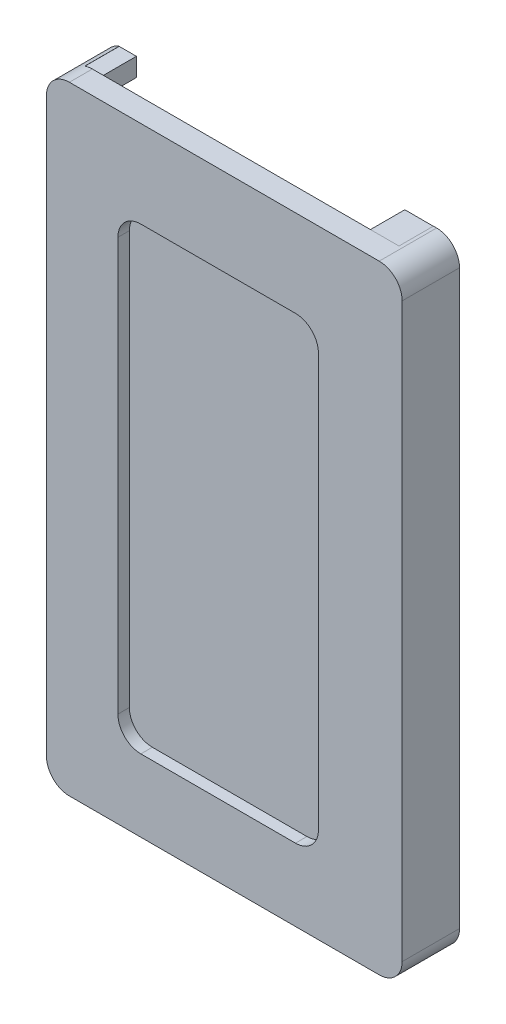
ISO-10303-21;
HEADER;
FILE_DESCRIPTION(('STEP AP214'),'2;1');
FILE_NAME('part.step','',(''),(''),'','','');
FILE_SCHEMA(('AUTOMOTIVE_DESIGN { 1 0 10303 214 1 1 1 1 }'));
ENDSEC;
DATA;
#1=APPLICATION_CONTEXT('core data for automotive mechanical design processes');
#2=APPLICATION_PROTOCOL_DEFINITION('international standard','automotive_design',2000,#1);
#3=PRODUCT_CONTEXT('',#1,'mechanical');
#4=PRODUCT('Part','Part','',(#3));
#5=PRODUCT_RELATED_PRODUCT_CATEGORY('part','',(#4));
#6=PRODUCT_DEFINITION_FORMATION('','',#4);
#7=PRODUCT_DEFINITION_CONTEXT('part definition',#1,'design');
#8=PRODUCT_DEFINITION('design','',#6,#7);
#9=PRODUCT_DEFINITION_SHAPE('','',#8);
#10=(LENGTH_UNIT() NAMED_UNIT(*) SI_UNIT(.MILLI.,.METRE.));
#11=(NAMED_UNIT(*) PLANE_ANGLE_UNIT() SI_UNIT($,.RADIAN.));
#12=(NAMED_UNIT(*) SI_UNIT($,.STERADIAN.) SOLID_ANGLE_UNIT());
#13=UNCERTAINTY_MEASURE_WITH_UNIT(LENGTH_MEASURE(1.E-05),#10,'distance_accuracy_value','');
#14=(GEOMETRIC_REPRESENTATION_CONTEXT(3) GLOBAL_UNCERTAINTY_ASSIGNED_CONTEXT((#13)) GLOBAL_UNIT_ASSIGNED_CONTEXT((#10,
#11,#12)) REPRESENTATION_CONTEXT('',''));
#15=CARTESIAN_POINT('',(0.,0.,0.));
#16=DIRECTION('',(0.,0.,1.));
#17=DIRECTION('',(1.,0.,0.));
#18=AXIS2_PLACEMENT_3D('',#15,#16,#17);
#19=CARTESIAN_POINT('',(38.4138867747377,-26.7518966455588,18.));
#20=DIRECTION('',(1.,0.,0.));
#21=DIRECTION('',(0.,0.,-1.));
#22=AXIS2_PLACEMENT_3D('',#19,#20,#21);
#23=PLANE('',#22);
#24=DIRECTION('',(0.,-1.,0.));
#25=VECTOR('',#24,1.);
#26=CARTESIAN_POINT('',(38.4138867747377,-26.7518966455588,18.));
#27=LINE('',#26,#25);
#28=CARTESIAN_POINT('',(38.4138867747377,-25.0005109041785,18.));
#29=VERTEX_POINT('',#28);
#30=CARTESIAN_POINT('',(38.4138867747377,-25.0095991490639,18.));
#31=VERTEX_POINT('',#30);
#32=EDGE_CURVE('E406',#29,#31,#27,.T.);
#33=ORIENTED_EDGE('',*,*,#32,.T.);
#34=DIRECTION('',(0.,0.,1.));
#35=VECTOR('',#34,1.);
#36=CARTESIAN_POINT('',(38.4138867747377,-25.0095991490639,15.));
#37=LINE('',#36,#35);
#38=CARTESIAN_POINT('',(38.4138867747377,-25.0095991490639,15.));
#39=VERTEX_POINT('',#38);
#40=EDGE_CURVE('E81',#39,#31,#37,.T.);
#41=ORIENTED_EDGE('',*,*,#40,.F.);
#42=DIRECTION('',(0.,-1.,0.));
#43=VECTOR('',#42,1.);
#44=CARTESIAN_POINT('',(38.4138867747377,-26.7518966455588,15.));
#45=LINE('',#44,#43);
#46=CARTESIAN_POINT('',(38.4138867747377,-25.0005109041785,15.));
#47=VERTEX_POINT('',#46);
#48=EDGE_CURVE('E274',#47,#39,#45,.T.);
#49=ORIENTED_EDGE('',*,*,#48,.F.);
#50=DIRECTION('',(0.,0.,1.));
#51=VECTOR('',#50,1.);
#52=CARTESIAN_POINT('',(38.4138867747377,-25.0005109041785,18.));
#53=LINE('',#52,#51);
#54=EDGE_CURVE('E66',#47,#29,#53,.T.);
#55=ORIENTED_EDGE('',*,*,#54,.T.);
#56=EDGE_LOOP('',(#33,#41,#49,#55));
#57=FACE_BOUND('',#56,.T.);
#58=ADVANCED_FACE('F58',(#57),#23,.T.);
#59=CARTESIAN_POINT('',(65.7954731172422,-26.7518966455588,18.));
#60=DIRECTION('',(1.,0.,0.));
#61=DIRECTION('',(0.,1.,0.));
#62=AXIS2_PLACEMENT_3D('',#59,#60,#61);
#63=PLANE('',#62);
#64=DIRECTION('',(0.,0.,1.));
#65=VECTOR('',#64,1.);
#66=CARTESIAN_POINT('',(65.7954731172422,-26.6161419497379,15.));
#67=LINE('',#66,#65);
#68=CARTESIAN_POINT('',(65.7954731172422,-26.6161419497379,15.));
#69=VERTEX_POINT('',#68);
#70=CARTESIAN_POINT('',(65.7954731172422,-26.6161419497379,18.));
#71=VERTEX_POINT('',#70);
#72=EDGE_CURVE('E320',#69,#71,#67,.T.);
#73=ORIENTED_EDGE('',*,*,#72,.F.);
#74=DIRECTION('',(0.,-1.,0.));
#75=VECTOR('',#74,1.);
#76=CARTESIAN_POINT('',(65.7954731172422,-26.7518966455588,15.));
#77=LINE('',#76,#75);
#78=CARTESIAN_POINT('',(65.7954731172423,-77.1753131264585,15.));
#79=VERTEX_POINT('',#78);
#80=EDGE_CURVE('E412',#69,#79,#77,.T.);
#81=ORIENTED_EDGE('',*,*,#80,.T.);
#82=DIRECTION('',(0.,0.,-1.));
#83=VECTOR('',#82,1.);
#84=CARTESIAN_POINT('',(65.7954731172423,-77.1753131264585,18.));
#85=LINE('',#84,#83);
#86=CARTESIAN_POINT('',(65.7954731172423,-77.1753131264585,18.));
#87=VERTEX_POINT('',#86);
#88=EDGE_CURVE('E417',#87,#79,#85,.T.);
#89=ORIENTED_EDGE('',*,*,#88,.F.);
#90=DIRECTION('',(0.,-1.,0.));
#91=VECTOR('',#90,1.);
#92=CARTESIAN_POINT('',(65.7954731172422,-26.7518966455588,18.));
#93=LINE('',#92,#91);
#94=EDGE_CURVE('E401',#71,#87,#93,.T.);
#95=ORIENTED_EDGE('',*,*,#94,.F.);
#96=EDGE_LOOP('',(#73,#81,#89,#95));
#97=FACE_BOUND('',#96,.T.);
#98=ADVANCED_FACE('F535',(#97),#63,.F.);
#99=CARTESIAN_POINT('',(0.,0.,15.));
#100=DIRECTION('',(0.,0.,-1.));
#101=DIRECTION('',(-1.,0.,0.));
#102=AXIS2_PLACEMENT_3D('',#99,#100,#101);
#103=PLANE('',#102);
#104=CARTESIAN_POINT('',(65.7954731172422,-24.8876513413796,15.));
#105=VERTEX_POINT('',#104);
#106=CARTESIAN_POINT('',(65.7954731172422,-24.894344301853,15.));
#107=VERTEX_POINT('',#106);
#108=EDGE_CURVE('E413',#105,#107,#77,.T.);
#109=ORIENTED_EDGE('',*,*,#108,.F.);
#110=DIRECTION('',(1.,0.,0.));
#111=VECTOR('',#110,1.);
#112=CARTESIAN_POINT('',(37.076231828528,-24.8876513413796,15.));
#113=LINE('',#112,#111);
#114=CARTESIAN_POINT('',(66.076231828528,-24.8876513413796,15.));
#115=VERTEX_POINT('',#114);
#116=EDGE_CURVE('E426',#105,#115,#113,.T.);
#117=ORIENTED_EDGE('',*,*,#116,.T.);
#118=CARTESIAN_POINT('',(66.076231828528,-26.8876513413796,15.));
#119=DIRECTION('',(0.,0.,-1.));
#120=DIRECTION('',(-1.,0.,0.));
#121=AXIS2_PLACEMENT_3D('',#118,#119,#120);
#122=CIRCLE('',#121,2.);
#123=CARTESIAN_POINT('',(68.076231828528,-26.8876513413796,15.));
#124=VERTEX_POINT('',#123);
#125=EDGE_CURVE('E436',#115,#124,#122,.T.);
#126=ORIENTED_EDGE('',*,*,#125,.T.);
#127=DIRECTION('',(0.,-1.,0.));
#128=VECTOR('',#127,1.);
#129=CARTESIAN_POINT('',(68.076231828528,-24.8876513413796,15.));
#130=LINE('',#129,#128);
#131=CARTESIAN_POINT('',(68.076231828528,-76.7564287427443,15.));
#132=VERTEX_POINT('',#131);
#133=EDGE_CURVE('E423',#124,#132,#130,.T.);
#134=ORIENTED_EDGE('',*,*,#133,.T.);
#135=CARTESIAN_POINT('',(66.076231828528,-76.7564287427443,15.));
#136=DIRECTION('',(0.,0.,-1.));
#137=DIRECTION('',(-1.,0.,0.));
#138=AXIS2_PLACEMENT_3D('',#135,#136,#137);
#139=CIRCLE('',#138,2.);
#140=CARTESIAN_POINT('',(66.076231828528,-78.7564287427443,15.));
#141=VERTEX_POINT('',#140);
#142=EDGE_CURVE('E442',#132,#141,#139,.T.);
#143=ORIENTED_EDGE('',*,*,#142,.T.);
#144=DIRECTION('',(1.,0.,0.));
#145=VECTOR('',#144,1.);
#146=CARTESIAN_POINT('',(37.076231828528,-78.7564287427443,15.));
#147=LINE('',#146,#145);
#148=CARTESIAN_POINT('',(55.1900802237575,-78.7564287427443,15.));
#149=VERTEX_POINT('',#148);
#150=EDGE_CURVE('E420',#149,#141,#147,.T.);
#151=ORIENTED_EDGE('',*,*,#150,.F.);
#152=DIRECTION('',(0.,-1.,0.));
#153=VECTOR('',#152,1.);
#154=CARTESIAN_POINT('',(55.1900802237575,-77.1753131264585,15.));
#155=LINE('',#154,#153);
#156=CARTESIAN_POINT('',(55.1900802237575,-77.1753131264585,15.));
#157=VERTEX_POINT('',#156);
#158=EDGE_CURVE('E375',#157,#149,#155,.T.);
#159=ORIENTED_EDGE('',*,*,#158,.F.);
#160=DIRECTION('',(1.,0.,0.));
#161=VECTOR('',#160,1.);
#162=CARTESIAN_POINT('',(38.4138867747377,-77.1753131264585,15.));
#163=LINE('',#162,#161);
#164=EDGE_CURVE('E390',#157,#79,#163,.T.);
#165=ORIENTED_EDGE('',*,*,#164,.T.);
#166=ORIENTED_EDGE('',*,*,#80,.F.);
#167=DIRECTION('',(-1.,0.,0.));
#168=VECTOR('',#167,1.);
#169=CARTESIAN_POINT('',(0.,-26.6161419497379,15.));
#170=LINE('',#169,#168);
#171=CARTESIAN_POINT('',(63.3048441622965,-26.6161419497379,15.));
#172=VERTEX_POINT('',#171);
#173=EDGE_CURVE('E310',#69,#172,#170,.T.);
#174=ORIENTED_EDGE('',*,*,#173,.T.);
#175=DIRECTION('',(0.,-1.,0.));
#176=VECTOR('',#175,1.);
#177=CARTESIAN_POINT('',(63.3048441622965,0.,15.));
#178=LINE('',#177,#176);
#179=CARTESIAN_POINT('',(63.3048441622965,-24.894344301853,15.));
#180=VERTEX_POINT('',#179);
#181=EDGE_CURVE('E303',#180,#172,#178,.T.);
#182=ORIENTED_EDGE('',*,*,#181,.F.);
#183=DIRECTION('',(-1.,0.,0.));
#184=VECTOR('',#183,1.);
#185=CARTESIAN_POINT('',(0.,-24.894344301853,15.));
#186=LINE('',#185,#184);
#187=EDGE_CURVE('E306',#107,#180,#186,.T.);
#188=ORIENTED_EDGE('',*,*,#187,.F.);
#189=EDGE_LOOP('',(#109,#117,#126,#134,#143,#151,#159,#165,#166,#174,#182,#188));
#190=FACE_BOUND('',#189,.T.);
#191=ADVANCED_FACE('F540',(#190),#103,.T.);
#192=CARTESIAN_POINT('',(39.076231828528,-26.8876513413796,15.));
#193=DIRECTION('',(0.,0.,-1.));
#194=DIRECTION('',(-1.,0.,0.));
#195=AXIS2_PLACEMENT_3D('',#192,#193,#194);
#196=CIRCLE('',#195,2.);
#197=CARTESIAN_POINT('',(37.076231828528,-26.8876513413796,15.));
#198=VERTEX_POINT('',#197);
#199=EDGE_CURVE('E438',#198,#47,#196,.T.);
#200=ORIENTED_EDGE('',*,*,#199,.T.);
#201=ORIENTED_EDGE('',*,*,#48,.T.);
#202=DIRECTION('',(1.,0.,0.));
#203=VECTOR('',#202,1.);
#204=CARTESIAN_POINT('',(0.,-25.0095991490639,15.));
#205=LINE('',#204,#203);
#206=CARTESIAN_POINT('',(39.9138867747377,-25.0095991490639,15.));
#207=VERTEX_POINT('',#206);
#208=EDGE_CURVE('E266',#39,#207,#205,.T.);
#209=ORIENTED_EDGE('',*,*,#208,.T.);
#210=DIRECTION('',(0.,-1.,0.));
#211=VECTOR('',#210,1.);
#212=CARTESIAN_POINT('',(39.9138867747377,0.,15.));
#213=LINE('',#212,#211);
#214=CARTESIAN_POINT('',(39.9138867747377,-26.6161419497379,15.));
#215=VERTEX_POINT('',#214);
#216=EDGE_CURVE('E272',#207,#215,#213,.T.);
#217=ORIENTED_EDGE('',*,*,#216,.T.);
#218=DIRECTION('',(1.,0.,0.));
#219=VECTOR('',#218,1.);
#220=CARTESIAN_POINT('',(0.,-26.616141949738,15.));
#221=LINE('',#220,#219);
#222=CARTESIAN_POINT('',(38.4138867747377,-26.6161419497379,15.));
#223=VERTEX_POINT('',#222);
#224=EDGE_CURVE('E276',#223,#215,#221,.T.);
#225=ORIENTED_EDGE('',*,*,#224,.F.);
#226=CARTESIAN_POINT('',(38.4138867747377,-77.1753131264585,15.));
#227=VERTEX_POINT('',#226);
#228=EDGE_CURVE('E73',#223,#227,#45,.T.);
#229=ORIENTED_EDGE('',*,*,#228,.T.);
#230=CARTESIAN_POINT('',(40.1900802237575,-77.1753131264585,15.));
#231=VERTEX_POINT('',#230);
#232=EDGE_CURVE('E409',#227,#231,#163,.T.);
#233=ORIENTED_EDGE('',*,*,#232,.T.);
#234=DIRECTION('',(0.,-1.,0.));
#235=VECTOR('',#234,1.);
#236=CARTESIAN_POINT('',(40.1900802237575,-77.1753131264585,15.));
#237=LINE('',#236,#235);
#238=CARTESIAN_POINT('',(40.1900802237575,-78.7564287427443,15.));
#239=VERTEX_POINT('',#238);
#240=EDGE_CURVE('E370',#231,#239,#237,.T.);
#241=ORIENTED_EDGE('',*,*,#240,.T.);
#242=CARTESIAN_POINT('',(39.076231828528,-78.7564287427443,15.));
#243=VERTEX_POINT('',#242);
#244=EDGE_CURVE('E421',#243,#239,#147,.T.);
#245=ORIENTED_EDGE('',*,*,#244,.F.);
#246=CARTESIAN_POINT('',(39.076231828528,-76.7564287427443,15.));
#247=DIRECTION('',(0.,0.,-1.));
#248=DIRECTION('',(-1.,0.,0.));
#249=AXIS2_PLACEMENT_3D('',#246,#247,#248);
#250=CIRCLE('',#249,2.);
#251=CARTESIAN_POINT('',(37.076231828528,-76.7564287427443,15.));
#252=VERTEX_POINT('',#251);
#253=EDGE_CURVE('E440',#243,#252,#250,.T.);
#254=ORIENTED_EDGE('',*,*,#253,.T.);
#255=DIRECTION('',(0.,-1.,0.));
#256=VECTOR('',#255,1.);
#257=CARTESIAN_POINT('',(37.076231828528,-24.8876513413796,15.));
#258=LINE('',#257,#256);
#259=EDGE_CURVE('E428',#198,#252,#258,.T.);
#260=ORIENTED_EDGE('',*,*,#259,.F.);
#261=EDGE_LOOP('',(#200,#201,#209,#217,#225,#229,#233,#241,#245,#254,#260));
#262=FACE_BOUND('',#261,.T.);
#263=ADVANCED_FACE('F269',(#262),#103,.T.);
#264=CARTESIAN_POINT('',(37.076231828528,-78.7564287427443,18.));
#265=DIRECTION('',(0.,1.,0.));
#266=DIRECTION('',(0.,0.,1.));
#267=AXIS2_PLACEMENT_3D('',#264,#265,#266);
#268=PLANE('',#267);
#269=ORIENTED_EDGE('',*,*,#150,.T.);
#270=DIRECTION('',(0.,0.,-1.));
#271=VECTOR('',#270,1.);
#272=CARTESIAN_POINT('',(66.076231828528,-78.7564287427443,20.));
#273=LINE('',#272,#271);
#274=CARTESIAN_POINT('',(66.076231828528,-78.7564287427443,20.));
#275=VERTEX_POINT('',#274);
#276=EDGE_CURVE('E447',#141,#275,#273,.F.);
#277=ORIENTED_EDGE('',*,*,#276,.T.);
#278=DIRECTION('',(1.,0.,0.));
#279=VECTOR('',#278,1.);
#280=CARTESIAN_POINT('',(37.076231828528,-78.7564287427443,20.));
#281=LINE('',#280,#279);
#282=CARTESIAN_POINT('',(39.076231828528,-78.7564287427443,20.));
#283=VERTEX_POINT('',#282);
#284=EDGE_CURVE('E361',#283,#275,#281,.T.);
#285=ORIENTED_EDGE('',*,*,#284,.F.);
#286=DIRECTION('',(0.,0.,-1.));
#287=VECTOR('',#286,1.);
#288=CARTESIAN_POINT('',(39.076231828528,-78.7564287427443,18.));
#289=LINE('',#288,#287);
#290=EDGE_CURVE('E444',#283,#243,#289,.T.);
#291=ORIENTED_EDGE('',*,*,#290,.T.);
#292=ORIENTED_EDGE('',*,*,#244,.T.);
#293=DIRECTION('',(0.,0.,-1.));
#294=VECTOR('',#293,1.);
#295=CARTESIAN_POINT('',(40.1900802237575,-78.7564287427443,16.));
#296=LINE('',#295,#294);
#297=CARTESIAN_POINT('',(40.1900802237575,-78.7564287427443,16.));
#298=VERTEX_POINT('',#297);
#299=EDGE_CURVE('E383',#298,#239,#296,.T.);
#300=ORIENTED_EDGE('',*,*,#299,.F.);
#301=DIRECTION('',(-1.,0.,0.));
#302=VECTOR('',#301,1.);
#303=CARTESIAN_POINT('',(55.1900802237575,-78.7564287427443,16.));
#304=LINE('',#303,#302);
#305=CARTESIAN_POINT('',(55.1900802237575,-78.7564287427443,16.));
#306=VERTEX_POINT('',#305);
#307=EDGE_CURVE('E371',#306,#298,#304,.T.);
#308=ORIENTED_EDGE('',*,*,#307,.F.);
#309=DIRECTION('',(0.,0.,-1.));
#310=VECTOR('',#309,1.);
#311=CARTESIAN_POINT('',(55.1900802237575,-78.7564287427443,16.));
#312=LINE('',#311,#310);
#313=EDGE_CURVE('E387',#306,#149,#312,.T.);
#314=ORIENTED_EDGE('',*,*,#313,.T.);
#315=EDGE_LOOP('',(#269,#277,#285,#291,#292,#300,#308,#314));
#316=FACE_BOUND('',#315,.T.);
#317=ADVANCED_FACE('F580',(#316),#268,.F.);
#318=CARTESIAN_POINT('',(68.076231828528,-24.8876513413796,18.));
#319=DIRECTION('',(1.,0.,0.));
#320=DIRECTION('',(0.,0.,-1.));
#321=AXIS2_PLACEMENT_3D('',#318,#319,#320);
#322=PLANE('',#321);
#323=DIRECTION('',(0.,1.,0.));
#324=VECTOR('',#323,1.);
#325=CARTESIAN_POINT('',(68.0762318285279,-24.8876513413796,20.));
#326=LINE('',#325,#324);
#327=CARTESIAN_POINT('',(68.076231828528,-76.7564287427443,20.));
#328=VERTEX_POINT('',#327);
#329=CARTESIAN_POINT('',(68.0762318285279,-26.8876513413796,20.));
#330=VERTEX_POINT('',#329);
#331=EDGE_CURVE('E364',#328,#330,#326,.T.);
#332=ORIENTED_EDGE('',*,*,#331,.F.);
#333=DIRECTION('',(0.,0.,-1.));
#334=VECTOR('',#333,1.);
#335=CARTESIAN_POINT('',(68.076231828528,-76.7564287427443,15.));
#336=LINE('',#335,#334);
#337=EDGE_CURVE('E433',#328,#132,#336,.T.);
#338=ORIENTED_EDGE('',*,*,#337,.T.);
#339=ORIENTED_EDGE('',*,*,#133,.F.);
#340=DIRECTION('',(0.,0.,-1.));
#341=VECTOR('',#340,1.);
#342=CARTESIAN_POINT('',(68.076231828528,-26.8876513413796,18.));
#343=LINE('',#342,#341);
#344=EDGE_CURVE('E431',#124,#330,#343,.F.);
#345=ORIENTED_EDGE('',*,*,#344,.T.);
#346=EDGE_LOOP('',(#332,#338,#339,#345));
#347=FACE_BOUND('',#346,.T.);
#348=ADVANCED_FACE('F586',(#347),#322,.T.);
#349=CARTESIAN_POINT('',(37.076231828528,-24.8876513413796,18.));
#350=DIRECTION('',(0.,1.,0.));
#351=DIRECTION('',(0.,0.,1.));
#352=AXIS2_PLACEMENT_3D('',#349,#350,#351);
#353=PLANE('',#352);
#354=DIRECTION('',(1.,0.,0.));
#355=VECTOR('',#354,1.);
#356=CARTESIAN_POINT('',(37.076231828528,-24.8876513413796,18.));
#357=LINE('',#356,#355);
#358=CARTESIAN_POINT('',(39.076231828528,-24.8876513413796,18.));
#359=VERTEX_POINT('',#358);
#360=CARTESIAN_POINT('',(65.7954731172422,-24.8876513413796,18.));
#361=VERTEX_POINT('',#360);
#362=EDGE_CURVE('E328',#359,#361,#357,.T.);
#363=ORIENTED_EDGE('',*,*,#362,.F.);
#364=DIRECTION('',(0.,0.,-1.));
#365=VECTOR('',#364,1.);
#366=CARTESIAN_POINT('',(39.076231828528,-24.8876513413796,20.));
#367=LINE('',#366,#365);
#368=CARTESIAN_POINT('',(39.076231828528,-24.8876513413796,20.));
#369=VERTEX_POINT('',#368);
#370=EDGE_CURVE('E465',#359,#369,#367,.F.);
#371=ORIENTED_EDGE('',*,*,#370,.T.);
#372=DIRECTION('',(-1.,0.,0.));
#373=VECTOR('',#372,1.);
#374=CARTESIAN_POINT('',(37.076231828528,-24.8876513413796,20.));
#375=LINE('',#374,#373);
#376=CARTESIAN_POINT('',(66.076231828528,-24.8876513413796,20.));
#377=VERTEX_POINT('',#376);
#378=EDGE_CURVE('E367',#377,#369,#375,.T.);
#379=ORIENTED_EDGE('',*,*,#378,.F.);
#380=DIRECTION('',(0.,0.,-1.));
#381=VECTOR('',#380,1.);
#382=CARTESIAN_POINT('',(66.076231828528,-24.8876513413796,18.));
#383=LINE('',#382,#381);
#384=EDGE_CURVE('E462',#377,#115,#383,.T.);
#385=ORIENTED_EDGE('',*,*,#384,.T.);
#386=ORIENTED_EDGE('',*,*,#116,.F.);
#387=DIRECTION('',(0.,0.,-1.));
#388=VECTOR('',#387,1.);
#389=CARTESIAN_POINT('',(65.7954731172422,-24.8876513413796,18.));
#390=LINE('',#389,#388);
#391=EDGE_CURVE('E331',#361,#105,#390,.T.);
#392=ORIENTED_EDGE('',*,*,#391,.F.);
#393=EDGE_LOOP('',(#363,#371,#379,#385,#386,#392));
#394=FACE_BOUND('',#393,.T.);
#395=ADVANCED_FACE('F515',(#394),#353,.T.);
#396=CARTESIAN_POINT('',(37.076231828528,-24.8876513413796,18.));
#397=DIRECTION('',(1.,0.,0.));
#398=DIRECTION('',(0.,1.,0.));
#399=AXIS2_PLACEMENT_3D('',#396,#397,#398);
#400=PLANE('',#399);
#401=ORIENTED_EDGE('',*,*,#259,.T.);
#402=DIRECTION('',(0.,0.,-1.));
#403=VECTOR('',#402,1.);
#404=CARTESIAN_POINT('',(37.076231828528,-76.7564287427443,18.));
#405=LINE('',#404,#403);
#406=CARTESIAN_POINT('',(37.076231828528,-76.7564287427443,20.));
#407=VERTEX_POINT('',#406);
#408=EDGE_CURVE('E460',#252,#407,#405,.F.);
#409=ORIENTED_EDGE('',*,*,#408,.T.);
#410=DIRECTION('',(0.,-1.,0.));
#411=VECTOR('',#410,1.);
#412=CARTESIAN_POINT('',(37.076231828528,-24.8876513413796,20.));
#413=LINE('',#412,#411);
#414=CARTESIAN_POINT('',(37.076231828528,-26.8876513413796,20.));
#415=VERTEX_POINT('',#414);
#416=EDGE_CURVE('E348',#415,#407,#413,.T.);
#417=ORIENTED_EDGE('',*,*,#416,.F.);
#418=DIRECTION('',(0.,0.,-1.));
#419=VECTOR('',#418,1.);
#420=CARTESIAN_POINT('',(37.076231828528,-26.8876513413796,15.));
#421=LINE('',#420,#419);
#422=EDGE_CURVE('E457',#415,#198,#421,.T.);
#423=ORIENTED_EDGE('',*,*,#422,.T.);
#424=EDGE_LOOP('',(#401,#409,#417,#423));
#425=FACE_BOUND('',#424,.T.);
#426=ADVANCED_FACE('F577',(#425),#400,.F.);
#427=CARTESIAN_POINT('',(38.4138867747377,-77.1753131264585,18.));
#428=DIRECTION('',(0.,1.,0.));
#429=DIRECTION('',(0.,0.,1.));
#430=AXIS2_PLACEMENT_3D('',#427,#428,#429);
#431=PLANE('',#430);
#432=DIRECTION('',(0.,0.,-1.));
#433=VECTOR('',#432,1.);
#434=CARTESIAN_POINT('',(55.1900802237575,-77.1753131264585,16.));
#435=LINE('',#434,#433);
#436=CARTESIAN_POINT('',(55.1900802237575,-77.1753131264585,16.));
#437=VERTEX_POINT('',#436);
#438=EDGE_CURVE('E391',#437,#157,#435,.T.);
#439=ORIENTED_EDGE('',*,*,#438,.F.);
#440=DIRECTION('',(-1.,0.,0.));
#441=VECTOR('',#440,1.);
#442=CARTESIAN_POINT('',(55.1900802237575,-77.1753131264585,16.));
#443=LINE('',#442,#441);
#444=CARTESIAN_POINT('',(40.1900802237575,-77.1753131264585,16.));
#445=VERTEX_POINT('',#444);
#446=EDGE_CURVE('E377',#437,#445,#443,.T.);
#447=ORIENTED_EDGE('',*,*,#446,.T.);
#448=DIRECTION('',(0.,0.,-1.));
#449=VECTOR('',#448,1.);
#450=CARTESIAN_POINT('',(40.1900802237575,-77.1753131264585,16.));
#451=LINE('',#450,#449);
#452=EDGE_CURVE('E393',#445,#231,#451,.T.);
#453=ORIENTED_EDGE('',*,*,#452,.T.);
#454=ORIENTED_EDGE('',*,*,#232,.F.);
#455=DIRECTION('',(0.,0.,-1.));
#456=VECTOR('',#455,1.);
#457=CARTESIAN_POINT('',(38.4138867747377,-77.1753131264585,18.));
#458=LINE('',#457,#456);
#459=CARTESIAN_POINT('',(38.4138867747377,-77.1753131264585,18.));
#460=VERTEX_POINT('',#459);
#461=EDGE_CURVE('E408',#460,#227,#458,.T.);
#462=ORIENTED_EDGE('',*,*,#461,.F.);
#463=DIRECTION('',(1.,0.,0.));
#464=VECTOR('',#463,1.);
#465=CARTESIAN_POINT('',(38.4138867747377,-77.1753131264585,18.));
#466=LINE('',#465,#464);
#467=EDGE_CURVE('E398',#460,#87,#466,.T.);
#468=ORIENTED_EDGE('',*,*,#467,.T.);
#469=ORIENTED_EDGE('',*,*,#88,.T.);
#470=ORIENTED_EDGE('',*,*,#164,.F.);
#471=EDGE_LOOP('',(#439,#447,#453,#454,#462,#468,#469,#470));
#472=FACE_BOUND('',#471,.T.);
#473=ADVANCED_FACE('F547',(#472),#431,.T.);
#474=ORIENTED_EDGE('',*,*,#108,.T.);
#475=DIRECTION('',(0.,0.,1.));
#476=VECTOR('',#475,1.);
#477=CARTESIAN_POINT('',(65.7954731172422,-24.894344301853,15.));
#478=LINE('',#477,#476);
#479=CARTESIAN_POINT('',(65.7954731172422,-24.894344301853,18.));
#480=VERTEX_POINT('',#479);
#481=EDGE_CURVE('E323',#107,#480,#478,.T.);
#482=ORIENTED_EDGE('',*,*,#481,.T.);
#483=EDGE_CURVE('E402',#361,#480,#93,.T.);
#484=ORIENTED_EDGE('',*,*,#483,.F.);
#485=ORIENTED_EDGE('',*,*,#391,.T.);
#486=EDGE_LOOP('',(#474,#482,#484,#485));
#487=FACE_BOUND('',#486,.T.);
#488=ADVANCED_FACE('F519',(#487),#63,.F.);
#489=DIRECTION('',(0.,0.,1.));
#490=VECTOR('',#489,1.);
#491=CARTESIAN_POINT('',(38.4138867747377,-26.6161419497379,15.));
#492=LINE('',#491,#490);
#493=CARTESIAN_POINT('',(38.4138867747377,-26.6161419497379,18.));
#494=VERTEX_POINT('',#493);
#495=EDGE_CURVE('E300',#223,#494,#492,.T.);
#496=ORIENTED_EDGE('',*,*,#495,.T.);
#497=EDGE_CURVE('E405',#494,#460,#27,.T.);
#498=ORIENTED_EDGE('',*,*,#497,.T.);
#499=ORIENTED_EDGE('',*,*,#461,.T.);
#500=ORIENTED_EDGE('',*,*,#228,.F.);
#501=EDGE_LOOP('',(#496,#498,#499,#500));
#502=FACE_BOUND('',#501,.T.);
#503=ADVANCED_FACE('F554',(#502),#23,.T.);
#504=CARTESIAN_POINT('',(55.1900802237575,-77.1753131264585,16.));
#505=DIRECTION('',(1.,0.,0.));
#506=DIRECTION('',(0.,0.,-1.));
#507=AXIS2_PLACEMENT_3D('',#504,#505,#506);
#508=PLANE('',#507);
#509=ORIENTED_EDGE('',*,*,#158,.T.);
#510=ORIENTED_EDGE('',*,*,#313,.F.);
#511=DIRECTION('',(0.,-1.,0.));
#512=VECTOR('',#511,1.);
#513=CARTESIAN_POINT('',(55.1900802237575,-77.1753131264585,16.));
#514=LINE('',#513,#512);
#515=EDGE_CURVE('E380',#437,#306,#514,.T.);
#516=ORIENTED_EDGE('',*,*,#515,.F.);
#517=ORIENTED_EDGE('',*,*,#438,.T.);
#518=EDGE_LOOP('',(#509,#510,#516,#517));
#519=FACE_BOUND('',#518,.T.);
#520=ADVANCED_FACE('F556',(#519),#508,.F.);
#521=CARTESIAN_POINT('',(40.1900802237575,-77.1753131264585,16.));
#522=DIRECTION('',(1.,0.,0.));
#523=DIRECTION('',(0.,0.,-1.));
#524=AXIS2_PLACEMENT_3D('',#521,#522,#523);
#525=PLANE('',#524);
#526=ORIENTED_EDGE('',*,*,#240,.F.);
#527=ORIENTED_EDGE('',*,*,#452,.F.);
#528=DIRECTION('',(0.,-1.,0.));
#529=VECTOR('',#528,1.);
#530=CARTESIAN_POINT('',(40.1900802237575,-77.1753131264585,16.));
#531=LINE('',#530,#529);
#532=EDGE_CURVE('E374',#445,#298,#531,.T.);
#533=ORIENTED_EDGE('',*,*,#532,.T.);
#534=ORIENTED_EDGE('',*,*,#299,.T.);
#535=EDGE_LOOP('',(#526,#527,#533,#534));
#536=FACE_BOUND('',#535,.T.);
#537=ADVANCED_FACE('F562',(#536),#525,.T.);
#538=CARTESIAN_POINT('',(0.,0.,16.));
#539=DIRECTION('',(0.,0.,1.));
#540=DIRECTION('',(1.,0.,0.));
#541=AXIS2_PLACEMENT_3D('',#538,#539,#540);
#542=PLANE('',#541);
#543=ORIENTED_EDGE('',*,*,#307,.T.);
#544=ORIENTED_EDGE('',*,*,#532,.F.);
#545=ORIENTED_EDGE('',*,*,#446,.F.);
#546=ORIENTED_EDGE('',*,*,#515,.T.);
#547=EDGE_LOOP('',(#543,#544,#545,#546));
#548=FACE_BOUND('',#547,.T.);
#549=ADVANCED_FACE('F678',(#548),#542,.F.);
#550=CARTESIAN_POINT('',(0.,0.,18.));
#551=DIRECTION('',(0.,0.,1.));
#552=DIRECTION('',(1.,0.,0.));
#553=AXIS2_PLACEMENT_3D('',#550,#551,#552);
#554=PLANE('',#553);
#555=ORIENTED_EDGE('',*,*,#497,.F.);
#556=DIRECTION('',(1.,0.,0.));
#557=VECTOR('',#556,1.);
#558=CARTESIAN_POINT('',(0.,-26.616141949738,18.));
#559=LINE('',#558,#557);
#560=CARTESIAN_POINT('',(39.9138867747377,-26.6161419497379,18.));
#561=VERTEX_POINT('',#560);
#562=EDGE_CURVE('E294',#494,#561,#559,.T.);
#563=ORIENTED_EDGE('',*,*,#562,.T.);
#564=DIRECTION('',(0.,-1.,0.));
#565=VECTOR('',#564,1.);
#566=CARTESIAN_POINT('',(39.9138867747377,0.,18.));
#567=LINE('',#566,#565);
#568=CARTESIAN_POINT('',(39.9138867747377,-25.0095991490639,18.));
#569=VERTEX_POINT('',#568);
#570=EDGE_CURVE('E297',#569,#561,#567,.T.);
#571=ORIENTED_EDGE('',*,*,#570,.F.);
#572=DIRECTION('',(1.,0.,0.));
#573=VECTOR('',#572,1.);
#574=CARTESIAN_POINT('',(0.,-25.0095991490639,18.));
#575=LINE('',#574,#573);
#576=EDGE_CURVE('E282',#31,#569,#575,.T.);
#577=ORIENTED_EDGE('',*,*,#576,.F.);
#578=ORIENTED_EDGE('',*,*,#32,.F.);
#579=CARTESIAN_POINT('',(39.076231828528,-26.8876513413796,18.));
#580=DIRECTION('',(0.,0.,1.));
#581=DIRECTION('',(1.,0.,0.));
#582=AXIS2_PLACEMENT_3D('',#579,#580,#581);
#583=CIRCLE('',#582,2.);
#584=EDGE_CURVE('E12',#29,#359,#583,.F.);
#585=ORIENTED_EDGE('',*,*,#584,.T.);
#586=ORIENTED_EDGE('',*,*,#362,.T.);
#587=ORIENTED_EDGE('',*,*,#483,.T.);
#588=DIRECTION('',(-1.,0.,0.));
#589=VECTOR('',#588,1.);
#590=CARTESIAN_POINT('',(0.,-24.894344301853,18.));
#591=LINE('',#590,#589);
#592=CARTESIAN_POINT('',(63.3048441622965,-24.894344301853,18.));
#593=VERTEX_POINT('',#592);
#594=EDGE_CURVE('E314',#480,#593,#591,.T.);
#595=ORIENTED_EDGE('',*,*,#594,.T.);
#596=DIRECTION('',(0.,-1.,0.));
#597=VECTOR('',#596,1.);
#598=CARTESIAN_POINT('',(63.3048441622965,0.,18.));
#599=LINE('',#598,#597);
#600=CARTESIAN_POINT('',(63.3048441622965,-26.6161419497379,18.));
#601=VERTEX_POINT('',#600);
#602=EDGE_CURVE('E302',#593,#601,#599,.T.);
#603=ORIENTED_EDGE('',*,*,#602,.T.);
#604=DIRECTION('',(-1.,0.,0.));
#605=VECTOR('',#604,1.);
#606=CARTESIAN_POINT('',(0.,-26.6161419497379,18.));
#607=LINE('',#606,#605);
#608=EDGE_CURVE('E307',#71,#601,#607,.T.);
#609=ORIENTED_EDGE('',*,*,#608,.F.);
#610=ORIENTED_EDGE('',*,*,#94,.T.);
#611=ORIENTED_EDGE('',*,*,#467,.F.);
#612=EDGE_LOOP('',(#555,#563,#571,#577,#578,#585,#586,#587,#595,#603,#609,#610,#611));
#613=FACE_BOUND('',#612,.T.);
#614=ADVANCED_FACE('F512',(#613),#554,.F.);
#615=CARTESIAN_POINT('',(0.,0.,20.));
#616=DIRECTION('',(0.,0.,1.));
#617=DIRECTION('',(1.,0.,0.));
#618=AXIS2_PLACEMENT_3D('',#615,#616,#617);
#619=PLANE('',#618);
#620=DIRECTION('',(0.,-1.,0.));
#621=VECTOR('',#620,1.);
#622=CARTESIAN_POINT('',(43.3020672379144,-32.4774415052826,20.));
#623=LINE('',#622,#621);
#624=CARTESIAN_POINT('',(43.3020672379144,-34.4774415052826,20.));
#625=VERTEX_POINT('',#624);
#626=CARTESIAN_POINT('',(43.3020672379144,-70.463909486633,20.));
#627=VERTEX_POINT('',#626);
#628=EDGE_CURVE('E334',#625,#627,#623,.T.);
#629=ORIENTED_EDGE('',*,*,#628,.F.);
#630=CARTESIAN_POINT('',(45.3020672379144,-34.4774415052826,20.));
#631=DIRECTION('',(0.,0.,1.));
#632=DIRECTION('',(1.,0.,0.));
#633=AXIS2_PLACEMENT_3D('',#630,#631,#632);
#634=CIRCLE('',#633,2.);
#635=CARTESIAN_POINT('',(45.3020672379144,-32.4774415052826,20.));
#636=VERTEX_POINT('',#635);
#637=EDGE_CURVE('E501',#625,#636,#634,.F.);
#638=ORIENTED_EDGE('',*,*,#637,.T.);
#639=DIRECTION('',(-1.,0.,0.));
#640=VECTOR('',#639,1.);
#641=CARTESIAN_POINT('',(43.3020672379144,-32.4774415052826,20.));
#642=LINE('',#641,#640);
#643=CARTESIAN_POINT('',(58.7770694664053,-32.4774415052826,20.));
#644=VERTEX_POINT('',#643);
#645=EDGE_CURVE('E339',#644,#636,#642,.T.);
#646=ORIENTED_EDGE('',*,*,#645,.F.);
#647=CARTESIAN_POINT('',(58.7770694664053,-34.4774415052826,20.));
#648=DIRECTION('',(0.,0.,1.));
#649=DIRECTION('',(1.,0.,0.));
#650=AXIS2_PLACEMENT_3D('',#647,#648,#649);
#651=CIRCLE('',#650,2.);
#652=CARTESIAN_POINT('',(60.7770694664053,-34.4774415052826,20.));
#653=VERTEX_POINT('',#652);
#654=EDGE_CURVE('E499',#644,#653,#651,.F.);
#655=ORIENTED_EDGE('',*,*,#654,.T.);
#656=DIRECTION('',(0.,1.,0.));
#657=VECTOR('',#656,1.);
#658=CARTESIAN_POINT('',(60.7770694664053,-32.4774415052826,20.));
#659=LINE('',#658,#657);
#660=CARTESIAN_POINT('',(60.7770694664053,-70.463909486633,20.));
#661=VERTEX_POINT('',#660);
#662=EDGE_CURVE('E354',#661,#653,#659,.T.);
#663=ORIENTED_EDGE('',*,*,#662,.F.);
#664=CARTESIAN_POINT('',(58.7770694664053,-70.463909486633,20.));
#665=DIRECTION('',(0.,0.,1.));
#666=DIRECTION('',(1.,0.,0.));
#667=AXIS2_PLACEMENT_3D('',#664,#665,#666);
#668=CIRCLE('',#667,2.);
#669=CARTESIAN_POINT('',(58.7770694664053,-72.463909486633,20.));
#670=VERTEX_POINT('',#669);
#671=EDGE_CURVE('E497',#661,#670,#668,.F.);
#672=ORIENTED_EDGE('',*,*,#671,.T.);
#673=DIRECTION('',(1.,0.,0.));
#674=VECTOR('',#673,1.);
#675=CARTESIAN_POINT('',(43.3020672379144,-72.463909486633,20.));
#676=LINE('',#675,#674);
#677=CARTESIAN_POINT('',(45.3020672379144,-72.463909486633,20.));
#678=VERTEX_POINT('',#677);
#679=EDGE_CURVE('E351',#678,#670,#676,.T.);
#680=ORIENTED_EDGE('',*,*,#679,.F.);
#681=CARTESIAN_POINT('',(45.3020672379144,-70.463909486633,20.));
#682=DIRECTION('',(0.,0.,1.));
#683=DIRECTION('',(1.,0.,0.));
#684=AXIS2_PLACEMENT_3D('',#681,#682,#683);
#685=CIRCLE('',#684,2.);
#686=EDGE_CURVE('E495',#678,#627,#685,.F.);
#687=ORIENTED_EDGE('',*,*,#686,.T.);
#688=EDGE_LOOP('',(#629,#638,#646,#655,#663,#672,#680,#687));
#689=FACE_BOUND('',#688,.T.);
#690=ORIENTED_EDGE('',*,*,#284,.T.);
#691=CARTESIAN_POINT('',(66.076231828528,-76.7564287427443,20.));
#692=DIRECTION('',(0.,0.,1.));
#693=DIRECTION('',(1.,0.,0.));
#694=AXIS2_PLACEMENT_3D('',#691,#692,#693);
#695=CIRCLE('',#694,2.);
#696=EDGE_CURVE('E455',#275,#328,#695,.T.);
#697=ORIENTED_EDGE('',*,*,#696,.T.);
#698=ORIENTED_EDGE('',*,*,#331,.T.);
#699=CARTESIAN_POINT('',(66.076231828528,-26.8876513413796,20.));
#700=DIRECTION('',(0.,0.,1.));
#701=DIRECTION('',(1.,0.,0.));
#702=AXIS2_PLACEMENT_3D('',#699,#700,#701);
#703=CIRCLE('',#702,2.);
#704=EDGE_CURVE('E449',#330,#377,#703,.T.);
#705=ORIENTED_EDGE('',*,*,#704,.T.);
#706=ORIENTED_EDGE('',*,*,#378,.T.);
#707=CARTESIAN_POINT('',(39.076231828528,-26.8876513413796,20.));
#708=DIRECTION('',(0.,0.,1.));
#709=DIRECTION('',(1.,0.,0.));
#710=AXIS2_PLACEMENT_3D('',#707,#708,#709);
#711=CIRCLE('',#710,2.);
#712=EDGE_CURVE('E451',#369,#415,#711,.T.);
#713=ORIENTED_EDGE('',*,*,#712,.T.);
#714=ORIENTED_EDGE('',*,*,#416,.T.);
#715=CARTESIAN_POINT('',(39.076231828528,-76.7564287427443,20.));
#716=DIRECTION('',(0.,0.,1.));
#717=DIRECTION('',(1.,0.,0.));
#718=AXIS2_PLACEMENT_3D('',#715,#716,#717);
#719=CIRCLE('',#718,2.);
#720=EDGE_CURVE('E453',#407,#283,#719,.T.);
#721=ORIENTED_EDGE('',*,*,#720,.T.);
#722=EDGE_LOOP('',(#690,#697,#698,#705,#706,#713,#714,#721));
#723=FACE_BOUND('',#722,.T.);
#724=ADVANCED_FACE('F652',(#689,#723),#619,.T.);
#725=CARTESIAN_POINT('',(43.3020672379144,-32.4774415052826,19.));
#726=DIRECTION('',(-1.,0.,0.));
#727=DIRECTION('',(0.,0.,1.));
#728=AXIS2_PLACEMENT_3D('',#725,#726,#727);
#729=PLANE('',#728);
#730=ORIENTED_EDGE('',*,*,#628,.T.);
#731=DIRECTION('',(0.,0.,1.));
#732=VECTOR('',#731,1.);
#733=CARTESIAN_POINT('',(43.3020672379144,-70.463909486633,19.));
#734=LINE('',#733,#732);
#735=CARTESIAN_POINT('',(43.3020672379144,-70.463909486633,19.));
#736=VERTEX_POINT('',#735);
#737=EDGE_CURVE('E475',#627,#736,#734,.F.);
#738=ORIENTED_EDGE('',*,*,#737,.T.);
#739=DIRECTION('',(0.,-1.,0.));
#740=VECTOR('',#739,1.);
#741=CARTESIAN_POINT('',(43.3020672379144,-32.4774415052826,19.));
#742=LINE('',#741,#740);
#743=CARTESIAN_POINT('',(43.3020672379144,-34.4774415052826,19.));
#744=VERTEX_POINT('',#743);
#745=EDGE_CURVE('E335',#744,#736,#742,.T.);
#746=ORIENTED_EDGE('',*,*,#745,.F.);
#747=DIRECTION('',(0.,0.,1.));
#748=VECTOR('',#747,1.);
#749=CARTESIAN_POINT('',(43.3020672379144,-34.4774415052826,20.));
#750=LINE('',#749,#748);
#751=EDGE_CURVE('E472',#744,#625,#750,.T.);
#752=ORIENTED_EDGE('',*,*,#751,.T.);
#753=EDGE_LOOP('',(#730,#738,#746,#752));
#754=FACE_BOUND('',#753,.T.);
#755=ADVANCED_FACE('F637',(#754),#729,.F.);
#756=CARTESIAN_POINT('',(43.3020672379144,-32.4774415052826,19.));
#757=DIRECTION('',(0.,1.,0.));
#758=DIRECTION('',(0.,0.,1.));
#759=AXIS2_PLACEMENT_3D('',#756,#757,#758);
#760=PLANE('',#759);
#761=DIRECTION('',(-1.,0.,0.));
#762=VECTOR('',#761,1.);
#763=CARTESIAN_POINT('',(43.3020672379144,-32.4774415052826,19.));
#764=LINE('',#763,#762);
#765=CARTESIAN_POINT('',(58.7770694664053,-32.4774415052826,19.));
#766=VERTEX_POINT('',#765);
#767=CARTESIAN_POINT('',(45.3020672379144,-32.4774415052826,19.));
#768=VERTEX_POINT('',#767);
#769=EDGE_CURVE('E345',#766,#768,#764,.T.);
#770=ORIENTED_EDGE('',*,*,#769,.F.);
#771=DIRECTION('',(0.,0.,1.));
#772=VECTOR('',#771,1.);
#773=CARTESIAN_POINT('',(58.7770694664053,-32.4774415052826,20.));
#774=LINE('',#773,#772);
#775=EDGE_CURVE('E492',#766,#644,#774,.T.);
#776=ORIENTED_EDGE('',*,*,#775,.T.);
#777=ORIENTED_EDGE('',*,*,#645,.T.);
#778=DIRECTION('',(0.,0.,1.));
#779=VECTOR('',#778,1.);
#780=CARTESIAN_POINT('',(45.3020672379144,-32.4774415052826,19.));
#781=LINE('',#780,#779);
#782=EDGE_CURVE('E490',#636,#768,#781,.F.);
#783=ORIENTED_EDGE('',*,*,#782,.T.);
#784=EDGE_LOOP('',(#770,#776,#777,#783));
#785=FACE_BOUND('',#784,.T.);
#786=ADVANCED_FACE('F630',(#785),#760,.F.);
#787=CARTESIAN_POINT('',(60.7770694664053,-32.4774415052826,19.));
#788=DIRECTION('',(1.,0.,0.));
#789=DIRECTION('',(0.,0.,-1.));
#790=AXIS2_PLACEMENT_3D('',#787,#788,#789);
#791=PLANE('',#790);
#792=DIRECTION('',(0.,1.,0.));
#793=VECTOR('',#792,1.);
#794=CARTESIAN_POINT('',(60.7770694664053,-32.4774415052826,19.));
#795=LINE('',#794,#793);
#796=CARTESIAN_POINT('',(60.7770694664053,-70.463909486633,19.));
#797=VERTEX_POINT('',#796);
#798=CARTESIAN_POINT('',(60.7770694664053,-34.4774415052826,19.));
#799=VERTEX_POINT('',#798);
#800=EDGE_CURVE('E342',#797,#799,#795,.T.);
#801=ORIENTED_EDGE('',*,*,#800,.F.);
#802=DIRECTION('',(0.,0.,1.));
#803=VECTOR('',#802,1.);
#804=CARTESIAN_POINT('',(60.7770694664053,-70.463909486633,20.));
#805=LINE('',#804,#803);
#806=EDGE_CURVE('E487',#797,#661,#805,.T.);
#807=ORIENTED_EDGE('',*,*,#806,.T.);
#808=ORIENTED_EDGE('',*,*,#662,.T.);
#809=DIRECTION('',(0.,0.,1.));
#810=VECTOR('',#809,1.);
#811=CARTESIAN_POINT('',(60.7770694664053,-34.4774415052826,19.));
#812=LINE('',#811,#810);
#813=EDGE_CURVE('E485',#653,#799,#812,.F.);
#814=ORIENTED_EDGE('',*,*,#813,.T.);
#815=EDGE_LOOP('',(#801,#807,#808,#814));
#816=FACE_BOUND('',#815,.T.);
#817=ADVANCED_FACE('F649',(#816),#791,.F.);
#818=CARTESIAN_POINT('',(43.3020672379144,-72.463909486633,19.));
#819=DIRECTION('',(0.,-1.,0.));
#820=DIRECTION('',(0.,0.,-1.));
#821=AXIS2_PLACEMENT_3D('',#818,#819,#820);
#822=PLANE('',#821);
#823=DIRECTION('',(1.,0.,0.));
#824=VECTOR('',#823,1.);
#825=CARTESIAN_POINT('',(43.3020672379144,-72.463909486633,19.));
#826=LINE('',#825,#824);
#827=CARTESIAN_POINT('',(45.3020672379144,-72.463909486633,19.));
#828=VERTEX_POINT('',#827);
#829=CARTESIAN_POINT('',(58.7770694664053,-72.463909486633,19.));
#830=VERTEX_POINT('',#829);
#831=EDGE_CURVE('E338',#828,#830,#826,.T.);
#832=ORIENTED_EDGE('',*,*,#831,.F.);
#833=DIRECTION('',(0.,0.,1.));
#834=VECTOR('',#833,1.);
#835=CARTESIAN_POINT('',(45.3020672379144,-72.463909486633,20.));
#836=LINE('',#835,#834);
#837=EDGE_CURVE('E469',#828,#678,#836,.T.);
#838=ORIENTED_EDGE('',*,*,#837,.T.);
#839=ORIENTED_EDGE('',*,*,#679,.T.);
#840=DIRECTION('',(0.,0.,1.));
#841=VECTOR('',#840,1.);
#842=CARTESIAN_POINT('',(58.7770694664053,-72.463909486633,19.));
#843=LINE('',#842,#841);
#844=EDGE_CURVE('E467',#670,#830,#843,.F.);
#845=ORIENTED_EDGE('',*,*,#844,.T.);
#846=EDGE_LOOP('',(#832,#838,#839,#845));
#847=FACE_BOUND('',#846,.T.);
#848=ADVANCED_FACE('F644',(#847),#822,.F.);
#849=CARTESIAN_POINT('',(0.,0.,19.));
#850=DIRECTION('',(0.,0.,1.));
#851=DIRECTION('',(1.,0.,0.));
#852=AXIS2_PLACEMENT_3D('',#849,#850,#851);
#853=PLANE('',#852);
#854=ORIENTED_EDGE('',*,*,#745,.T.);
#855=CARTESIAN_POINT('',(45.3020672379144,-70.463909486633,19.));
#856=DIRECTION('',(0.,0.,1.));
#857=DIRECTION('',(1.,0.,0.));
#858=AXIS2_PLACEMENT_3D('',#855,#856,#857);
#859=CIRCLE('',#858,2.);
#860=EDGE_CURVE('E483',#736,#828,#859,.T.);
#861=ORIENTED_EDGE('',*,*,#860,.T.);
#862=ORIENTED_EDGE('',*,*,#831,.T.);
#863=CARTESIAN_POINT('',(58.7770694664053,-70.463909486633,19.));
#864=DIRECTION('',(0.,0.,1.));
#865=DIRECTION('',(1.,0.,0.));
#866=AXIS2_PLACEMENT_3D('',#863,#864,#865);
#867=CIRCLE('',#866,2.);
#868=EDGE_CURVE('E481',#830,#797,#867,.T.);
#869=ORIENTED_EDGE('',*,*,#868,.T.);
#870=ORIENTED_EDGE('',*,*,#800,.T.);
#871=CARTESIAN_POINT('',(58.7770694664053,-34.4774415052826,19.));
#872=DIRECTION('',(0.,0.,1.));
#873=DIRECTION('',(1.,0.,0.));
#874=AXIS2_PLACEMENT_3D('',#871,#872,#873);
#875=CIRCLE('',#874,2.);
#876=EDGE_CURVE('E479',#799,#766,#875,.T.);
#877=ORIENTED_EDGE('',*,*,#876,.T.);
#878=ORIENTED_EDGE('',*,*,#769,.T.);
#879=CARTESIAN_POINT('',(45.3020672379144,-34.4774415052826,19.));
#880=DIRECTION('',(0.,0.,1.));
#881=DIRECTION('',(1.,0.,0.));
#882=AXIS2_PLACEMENT_3D('',#879,#880,#881);
#883=CIRCLE('',#882,2.);
#884=EDGE_CURVE('E477',#768,#744,#883,.T.);
#885=ORIENTED_EDGE('',*,*,#884,.T.);
#886=EDGE_LOOP('',(#854,#861,#862,#869,#870,#877,#878,#885));
#887=FACE_BOUND('',#886,.T.);
#888=ADVANCED_FACE('F597',(#887),#853,.T.);
#889=CARTESIAN_POINT('',(66.076231828528,-76.7564287427443,18.));
#890=DIRECTION('',(0.,0.,1.));
#891=DIRECTION('',(1.,0.,0.));
#892=AXIS2_PLACEMENT_3D('',#889,#890,#891);
#893=CYLINDRICAL_SURFACE('',#892,2.);
#894=ORIENTED_EDGE('',*,*,#696,.F.);
#895=ORIENTED_EDGE('',*,*,#276,.F.);
#896=ORIENTED_EDGE('',*,*,#142,.F.);
#897=ORIENTED_EDGE('',*,*,#337,.F.);
#898=EDGE_LOOP('',(#894,#895,#896,#897));
#899=FACE_BOUND('',#898,.T.);
#900=ADVANCED_FACE('F593',(#899),#893,.T.);
#901=CARTESIAN_POINT('',(39.076231828528,-76.7564287427443,18.));
#902=DIRECTION('',(0.,0.,-1.));
#903=DIRECTION('',(-1.,0.,0.));
#904=AXIS2_PLACEMENT_3D('',#901,#902,#903);
#905=CYLINDRICAL_SURFACE('',#904,2.);
#906=ORIENTED_EDGE('',*,*,#720,.F.);
#907=ORIENTED_EDGE('',*,*,#408,.F.);
#908=ORIENTED_EDGE('',*,*,#253,.F.);
#909=ORIENTED_EDGE('',*,*,#290,.F.);
#910=EDGE_LOOP('',(#906,#907,#908,#909));
#911=FACE_BOUND('',#910,.T.);
#912=ADVANCED_FACE('F596',(#911),#905,.T.);
#913=CARTESIAN_POINT('',(39.076231828528,-26.8876513413796,18.));
#914=DIRECTION('',(0.,0.,1.));
#915=DIRECTION('',(1.,0.,0.));
#916=AXIS2_PLACEMENT_3D('',#913,#914,#915);
#917=CYLINDRICAL_SURFACE('',#916,2.);
#918=ORIENTED_EDGE('',*,*,#584,.F.);
#919=ORIENTED_EDGE('',*,*,#54,.F.);
#920=ORIENTED_EDGE('',*,*,#199,.F.);
#921=ORIENTED_EDGE('',*,*,#422,.F.);
#922=ORIENTED_EDGE('',*,*,#712,.F.);
#923=ORIENTED_EDGE('',*,*,#370,.F.);
#924=EDGE_LOOP('',(#918,#919,#920,#921,#922,#923));
#925=FACE_BOUND('',#924,.T.);
#926=ADVANCED_FACE('F507',(#925),#917,.T.);
#927=CARTESIAN_POINT('',(66.076231828528,-26.8876513413796,18.));
#928=DIRECTION('',(0.,0.,-1.));
#929=DIRECTION('',(-1.,0.,0.));
#930=AXIS2_PLACEMENT_3D('',#927,#928,#929);
#931=CYLINDRICAL_SURFACE('',#930,2.);
#932=ORIENTED_EDGE('',*,*,#704,.F.);
#933=ORIENTED_EDGE('',*,*,#344,.F.);
#934=ORIENTED_EDGE('',*,*,#125,.F.);
#935=ORIENTED_EDGE('',*,*,#384,.F.);
#936=EDGE_LOOP('',(#932,#933,#934,#935));
#937=FACE_BOUND('',#936,.T.);
#938=ADVANCED_FACE('F604',(#937),#931,.T.);
#939=CARTESIAN_POINT('',(45.3020672379144,-70.463909486633,19.));
#940=DIRECTION('',(0.,0.,-1.));
#941=DIRECTION('',(-1.,0.,0.));
#942=AXIS2_PLACEMENT_3D('',#939,#940,#941);
#943=CYLINDRICAL_SURFACE('',#942,2.);
#944=ORIENTED_EDGE('',*,*,#860,.F.);
#945=ORIENTED_EDGE('',*,*,#737,.F.);
#946=ORIENTED_EDGE('',*,*,#686,.F.);
#947=ORIENTED_EDGE('',*,*,#837,.F.);
#948=EDGE_LOOP('',(#944,#945,#946,#947));
#949=FACE_BOUND('',#948,.T.);
#950=ADVANCED_FACE('F607',(#949),#943,.F.);
#951=CARTESIAN_POINT('',(58.7770694664053,-70.463909486633,19.));
#952=DIRECTION('',(0.,0.,-1.));
#953=DIRECTION('',(-1.,0.,0.));
#954=AXIS2_PLACEMENT_3D('',#951,#952,#953);
#955=CYLINDRICAL_SURFACE('',#954,2.);
#956=ORIENTED_EDGE('',*,*,#868,.F.);
#957=ORIENTED_EDGE('',*,*,#844,.F.);
#958=ORIENTED_EDGE('',*,*,#671,.F.);
#959=ORIENTED_EDGE('',*,*,#806,.F.);
#960=EDGE_LOOP('',(#956,#957,#958,#959));
#961=FACE_BOUND('',#960,.T.);
#962=ADVANCED_FACE('F611',(#961),#955,.F.);
#963=CARTESIAN_POINT('',(58.7770694664053,-34.4774415052826,19.));
#964=DIRECTION('',(0.,0.,-1.));
#965=DIRECTION('',(-1.,0.,0.));
#966=AXIS2_PLACEMENT_3D('',#963,#964,#965);
#967=CYLINDRICAL_SURFACE('',#966,2.);
#968=ORIENTED_EDGE('',*,*,#876,.F.);
#969=ORIENTED_EDGE('',*,*,#813,.F.);
#970=ORIENTED_EDGE('',*,*,#654,.F.);
#971=ORIENTED_EDGE('',*,*,#775,.F.);
#972=EDGE_LOOP('',(#968,#969,#970,#971));
#973=FACE_BOUND('',#972,.T.);
#974=ADVANCED_FACE('F614',(#973),#967,.F.);
#975=CARTESIAN_POINT('',(45.3020672379144,-34.4774415052826,19.));
#976=DIRECTION('',(0.,0.,-1.));
#977=DIRECTION('',(-1.,0.,0.));
#978=AXIS2_PLACEMENT_3D('',#975,#976,#977);
#979=CYLINDRICAL_SURFACE('',#978,2.);
#980=ORIENTED_EDGE('',*,*,#884,.F.);
#981=ORIENTED_EDGE('',*,*,#782,.F.);
#982=ORIENTED_EDGE('',*,*,#637,.F.);
#983=ORIENTED_EDGE('',*,*,#751,.F.);
#984=EDGE_LOOP('',(#980,#981,#982,#983));
#985=FACE_BOUND('',#984,.T.);
#986=ADVANCED_FACE('F60',(#985),#979,.F.);
#987=CARTESIAN_POINT('',(63.3048441622965,0.,15.));
#988=DIRECTION('',(-1.,0.,0.));
#989=DIRECTION('',(0.,0.,1.));
#990=AXIS2_PLACEMENT_3D('',#987,#988,#989);
#991=PLANE('',#990);
#992=ORIENTED_EDGE('',*,*,#602,.F.);
#993=DIRECTION('',(0.,0.,1.));
#994=VECTOR('',#993,1.);
#995=CARTESIAN_POINT('',(63.3048441622965,-24.894344301853,15.));
#996=LINE('',#995,#994);
#997=EDGE_CURVE('E325',#180,#593,#996,.T.);
#998=ORIENTED_EDGE('',*,*,#997,.F.);
#999=ORIENTED_EDGE('',*,*,#181,.T.);
#1000=DIRECTION('',(0.,0.,1.));
#1001=VECTOR('',#1000,1.);
#1002=CARTESIAN_POINT('',(63.3048441622965,-26.6161419497379,15.));
#1003=LINE('',#1002,#1001);
#1004=EDGE_CURVE('E312',#172,#601,#1003,.T.);
#1005=ORIENTED_EDGE('',*,*,#1004,.T.);
#1006=EDGE_LOOP('',(#992,#998,#999,#1005));
#1007=FACE_BOUND('',#1006,.T.);
#1008=ADVANCED_FACE('F528',(#1007),#991,.T.);
#1009=CARTESIAN_POINT('',(0.,-24.894344301853,15.));
#1010=DIRECTION('',(0.,1.,0.));
#1011=DIRECTION('',(0.,0.,1.));
#1012=AXIS2_PLACEMENT_3D('',#1009,#1010,#1011);
#1013=PLANE('',#1012);
#1014=ORIENTED_EDGE('',*,*,#594,.F.);
#1015=ORIENTED_EDGE('',*,*,#481,.F.);
#1016=ORIENTED_EDGE('',*,*,#187,.T.);
#1017=ORIENTED_EDGE('',*,*,#997,.T.);
#1018=EDGE_LOOP('',(#1014,#1015,#1016,#1017));
#1019=FACE_BOUND('',#1018,.T.);
#1020=ADVANCED_FACE('F523',(#1019),#1013,.T.);
#1021=CARTESIAN_POINT('',(0.,-26.6161419497379,15.));
#1022=DIRECTION('',(0.,1.,0.));
#1023=DIRECTION('',(0.,0.,1.));
#1024=AXIS2_PLACEMENT_3D('',#1021,#1022,#1023);
#1025=PLANE('',#1024);
#1026=ORIENTED_EDGE('',*,*,#608,.T.);
#1027=ORIENTED_EDGE('',*,*,#1004,.F.);
#1028=ORIENTED_EDGE('',*,*,#173,.F.);
#1029=ORIENTED_EDGE('',*,*,#72,.T.);
#1030=EDGE_LOOP('',(#1026,#1027,#1028,#1029));
#1031=FACE_BOUND('',#1030,.T.);
#1032=ADVANCED_FACE('F538',(#1031),#1025,.F.);
#1033=CARTESIAN_POINT('',(0.,-26.616141949738,15.));
#1034=DIRECTION('',(0.,-1.,0.));
#1035=DIRECTION('',(1.,0.,0.));
#1036=AXIS2_PLACEMENT_3D('',#1033,#1034,#1035);
#1037=PLANE('',#1036);
#1038=ORIENTED_EDGE('',*,*,#562,.F.);
#1039=ORIENTED_EDGE('',*,*,#495,.F.);
#1040=ORIENTED_EDGE('',*,*,#224,.T.);
#1041=DIRECTION('',(0.,0.,1.));
#1042=VECTOR('',#1041,1.);
#1043=CARTESIAN_POINT('',(39.9138867747377,-26.6161419497379,15.));
#1044=LINE('',#1043,#1042);
#1045=EDGE_CURVE('E285',#215,#561,#1044,.T.);
#1046=ORIENTED_EDGE('',*,*,#1045,.T.);
#1047=EDGE_LOOP('',(#1038,#1039,#1040,#1046));
#1048=FACE_BOUND('',#1047,.T.);
#1049=ADVANCED_FACE('F552',(#1048),#1037,.T.);
#1050=CARTESIAN_POINT('',(0.,-25.0095991490639,15.));
#1051=DIRECTION('',(0.,-1.,0.));
#1052=DIRECTION('',(0.,0.,-1.));
#1053=AXIS2_PLACEMENT_3D('',#1050,#1051,#1052);
#1054=PLANE('',#1053);
#1055=ORIENTED_EDGE('',*,*,#576,.T.);
#1056=DIRECTION('',(0.,0.,1.));
#1057=VECTOR('',#1056,1.);
#1058=CARTESIAN_POINT('',(39.9138867747377,-25.0095991490639,15.));
#1059=LINE('',#1058,#1057);
#1060=EDGE_CURVE('E280',#207,#569,#1059,.T.);
#1061=ORIENTED_EDGE('',*,*,#1060,.F.);
#1062=ORIENTED_EDGE('',*,*,#208,.F.);
#1063=ORIENTED_EDGE('',*,*,#40,.T.);
#1064=EDGE_LOOP('',(#1055,#1061,#1062,#1063));
#1065=FACE_BOUND('',#1064,.T.);
#1066=ADVANCED_FACE('F281',(#1065),#1054,.F.);
#1067=CARTESIAN_POINT('',(39.9138867747377,0.,15.));
#1068=DIRECTION('',(-1.,0.,0.));
#1069=DIRECTION('',(0.,0.,1.));
#1070=AXIS2_PLACEMENT_3D('',#1067,#1068,#1069);
#1071=PLANE('',#1070);
#1072=ORIENTED_EDGE('',*,*,#570,.T.);
#1073=ORIENTED_EDGE('',*,*,#1045,.F.);
#1074=ORIENTED_EDGE('',*,*,#216,.F.);
#1075=ORIENTED_EDGE('',*,*,#1060,.T.);
#1076=EDGE_LOOP('',(#1072,#1073,#1074,#1075));
#1077=FACE_BOUND('',#1076,.T.);
#1078=ADVANCED_FACE('F287',(#1077),#1071,.F.);
#1079=CLOSED_SHELL('',(#58,#98,#191,#263,#317,#348,#395,#426,#473,#488,#503,#520,#537,#549,#614,
#724,#755,#786,#817,#848,#888,#900,#912,#926,#938,#950,#962,#974,#986,#1008,#1020,#1032,#1049,
#1066,#1078));
#1080=MANIFOLD_SOLID_BREP('B2',#1079);
#1081=ADVANCED_BREP_SHAPE_REPRESENTATION('',(#18,#1080),#14);
#1082=SHAPE_DEFINITION_REPRESENTATION(#9,#1081);
ENDSEC;
END-ISO-10303-21;
